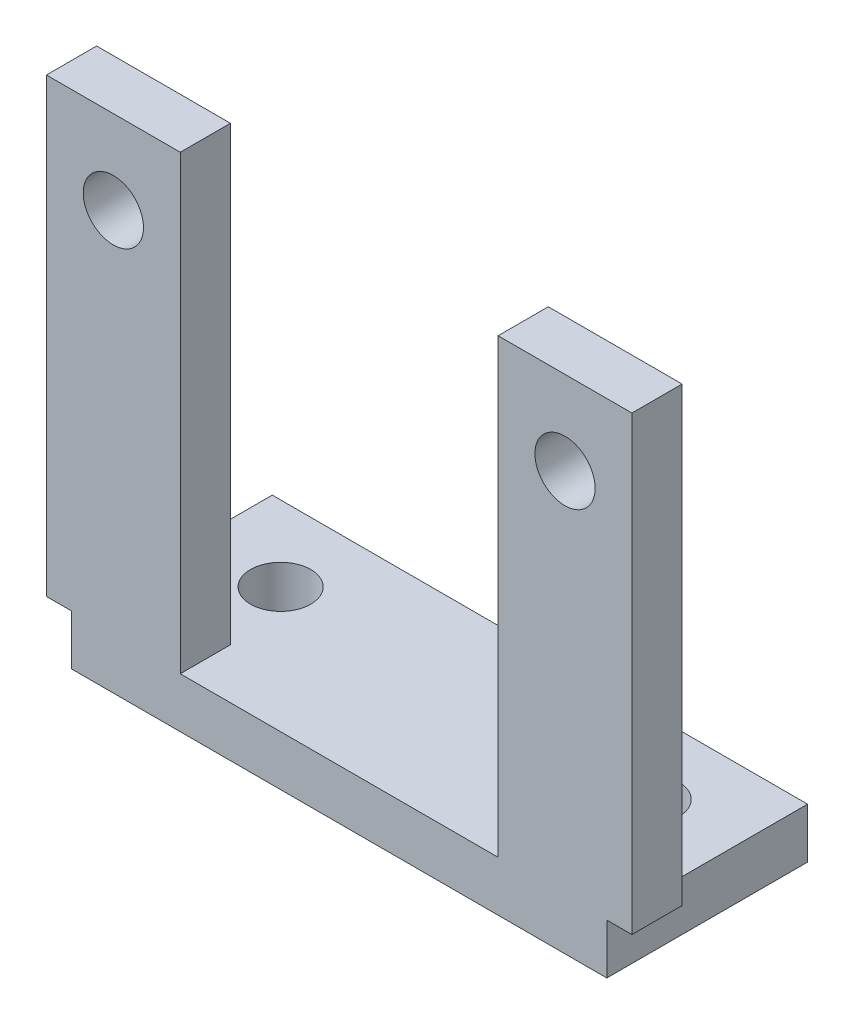
ISO-10303-21;
HEADER;
FILE_DESCRIPTION(('STEP AP214'),'2;1');
FILE_NAME('part.step','',(''),(''),'','','');
FILE_SCHEMA(('AUTOMOTIVE_DESIGN { 1 0 10303 214 1 1 1 1 }'));
ENDSEC;
DATA;
#1=APPLICATION_CONTEXT('core data for automotive mechanical design processes');
#2=APPLICATION_PROTOCOL_DEFINITION('international standard','automotive_design',2000,#1);
#3=PRODUCT_CONTEXT('',#1,'mechanical');
#4=PRODUCT('Part','Part','',(#3));
#5=PRODUCT_RELATED_PRODUCT_CATEGORY('part','',(#4));
#6=PRODUCT_DEFINITION_FORMATION('','',#4);
#7=PRODUCT_DEFINITION_CONTEXT('part definition',#1,'design');
#8=PRODUCT_DEFINITION('design','',#6,#7);
#9=PRODUCT_DEFINITION_SHAPE('','',#8);
#10=(LENGTH_UNIT() NAMED_UNIT(*) SI_UNIT(.MILLI.,.METRE.));
#11=(NAMED_UNIT(*) PLANE_ANGLE_UNIT() SI_UNIT($,.RADIAN.));
#12=(NAMED_UNIT(*) SI_UNIT($,.STERADIAN.) SOLID_ANGLE_UNIT());
#13=UNCERTAINTY_MEASURE_WITH_UNIT(LENGTH_MEASURE(1.E-05),#10,'distance_accuracy_value','');
#14=(GEOMETRIC_REPRESENTATION_CONTEXT(3) GLOBAL_UNCERTAINTY_ASSIGNED_CONTEXT((#13)) GLOBAL_UNIT_ASSIGNED_CONTEXT((#10,
#11,#12)) REPRESENTATION_CONTEXT('',''));
#15=CARTESIAN_POINT('',(0.,0.,0.));
#16=DIRECTION('',(0.,0.,1.));
#17=DIRECTION('',(1.,0.,0.));
#18=AXIS2_PLACEMENT_3D('',#15,#16,#17);
#19=CARTESIAN_POINT('',(0.,3.,0.));
#20=DIRECTION('',(0.,-1.,0.));
#21=DIRECTION('',(0.,0.,-1.));
#22=AXIS2_PLACEMENT_3D('',#19,#20,#21);
#23=PLANE('',#22);
#24=CARTESIAN_POINT('',(-11.,3.,-4.5));
#25=DIRECTION('',(0.,1.,0.));
#26=DIRECTION('',(0.,0.,1.));
#27=AXIS2_PLACEMENT_3D('',#24,#25,#26);
#28=CIRCLE('',#27,1.8);
#29=CARTESIAN_POINT('',(-11.,3.,-2.7));
#30=VERTEX_POINT('',#29);
#31=EDGE_CURVE('E303',#30,#30,#28,.T.);
#32=ORIENTED_EDGE('',*,*,#31,.F.);
#33=EDGE_LOOP('',(#32));
#34=FACE_BOUND('',#33,.T.);
#35=CARTESIAN_POINT('',(11.,3.,-4.5));
#36=DIRECTION('',(0.,1.,0.));
#37=DIRECTION('',(0.,0.,1.));
#38=AXIS2_PLACEMENT_3D('',#35,#36,#37);
#39=CIRCLE('',#38,1.8);
#40=CARTESIAN_POINT('',(11.,3.,-2.7));
#41=VERTEX_POINT('',#40);
#42=EDGE_CURVE('E310',#41,#41,#39,.T.);
#43=ORIENTED_EDGE('',*,*,#42,.F.);
#44=EDGE_LOOP('',(#43));
#45=FACE_BOUND('',#44,.T.);
#46=DIRECTION('',(0.,0.,-1.));
#47=VECTOR('',#46,1.);
#48=CARTESIAN_POINT('',(9.5,3.,3.));
#49=LINE('',#48,#47);
#50=CARTESIAN_POINT('',(9.5,3.,3.));
#51=VERTEX_POINT('',#50);
#52=CARTESIAN_POINT('',(9.5,3.,0.));
#53=VERTEX_POINT('',#52);
#54=EDGE_CURVE('E149',#51,#53,#49,.T.);
#55=ORIENTED_EDGE('',*,*,#54,.T.);
#56=DIRECTION('',(1.,0.,0.));
#57=VECTOR('',#56,1.);
#58=CARTESIAN_POINT('',(9.5,3.,0.));
#59=LINE('',#58,#57);
#60=CARTESIAN_POINT('',(16.,3.,0.));
#61=VERTEX_POINT('',#60);
#62=EDGE_CURVE('E52',#53,#61,#59,.T.);
#63=ORIENTED_EDGE('',*,*,#62,.T.);
#64=DIRECTION('',(0.,0.,-1.));
#65=VECTOR('',#64,1.);
#66=CARTESIAN_POINT('',(16.,3.,-9.));
#67=LINE('',#66,#65);
#68=CARTESIAN_POINT('',(16.,3.,-9.));
#69=VERTEX_POINT('',#68);
#70=EDGE_CURVE('E210',#61,#69,#67,.T.);
#71=ORIENTED_EDGE('',*,*,#70,.T.);
#72=DIRECTION('',(-1.,0.,0.));
#73=VECTOR('',#72,1.);
#74=CARTESIAN_POINT('',(-16.,3.,-9.));
#75=LINE('',#74,#73);
#76=CARTESIAN_POINT('',(-16.,3.,-9.));
#77=VERTEX_POINT('',#76);
#78=EDGE_CURVE('E213',#69,#77,#75,.T.);
#79=ORIENTED_EDGE('',*,*,#78,.T.);
#80=DIRECTION('',(0.,0.,1.));
#81=VECTOR('',#80,1.);
#82=CARTESIAN_POINT('',(-16.,3.,3.));
#83=LINE('',#82,#81);
#84=CARTESIAN_POINT('',(-16.,3.,0.));
#85=VERTEX_POINT('',#84);
#86=EDGE_CURVE('E205',#77,#85,#83,.T.);
#87=ORIENTED_EDGE('',*,*,#86,.T.);
#88=DIRECTION('',(1.,0.,0.));
#89=VECTOR('',#88,1.);
#90=CARTESIAN_POINT('',(-17.5,3.,0.));
#91=LINE('',#90,#89);
#92=CARTESIAN_POINT('',(-9.5,3.,0.));
#93=VERTEX_POINT('',#92);
#94=EDGE_CURVE('E11',#85,#93,#91,.T.);
#95=ORIENTED_EDGE('',*,*,#94,.T.);
#96=DIRECTION('',(0.,0.,-1.));
#97=VECTOR('',#96,1.);
#98=CARTESIAN_POINT('',(-9.5,3.,3.));
#99=LINE('',#98,#97);
#100=CARTESIAN_POINT('',(-9.5,3.,3.));
#101=VERTEX_POINT('',#100);
#102=EDGE_CURVE('E198',#101,#93,#99,.T.);
#103=ORIENTED_EDGE('',*,*,#102,.F.);
#104=DIRECTION('',(1.,0.,0.));
#105=VECTOR('',#104,1.);
#106=CARTESIAN_POINT('',(16.,3.,3.));
#107=LINE('',#106,#105);
#108=EDGE_CURVE('E58',#101,#51,#107,.T.);
#109=ORIENTED_EDGE('',*,*,#108,.T.);
#110=EDGE_LOOP('',(#55,#63,#71,#79,#87,#95,#103,#109));
#111=FACE_BOUND('',#110,.T.);
#112=ADVANCED_FACE('F35',(#34,#45,#111),#23,.F.);
#113=CARTESIAN_POINT('',(-16.,3.,3.));
#114=DIRECTION('',(1.,0.,0.));
#115=DIRECTION('',(0.,0.,-1.));
#116=AXIS2_PLACEMENT_3D('',#113,#114,#115);
#117=PLANE('',#116);
#118=DIRECTION('',(0.,0.,1.));
#119=VECTOR('',#118,1.);
#120=CARTESIAN_POINT('',(-16.,0.,3.));
#121=LINE('',#120,#119);
#122=CARTESIAN_POINT('',(-16.,0.,-9.));
#123=VERTEX_POINT('',#122);
#124=CARTESIAN_POINT('',(-16.,0.,3.));
#125=VERTEX_POINT('',#124);
#126=EDGE_CURVE('E204',#123,#125,#121,.T.);
#127=ORIENTED_EDGE('',*,*,#126,.T.);
#128=DIRECTION('',(0.,-1.,0.));
#129=VECTOR('',#128,1.);
#130=CARTESIAN_POINT('',(-16.,3.,3.));
#131=LINE('',#130,#129);
#132=CARTESIAN_POINT('',(-16.,3.,3.));
#133=VERTEX_POINT('',#132);
#134=EDGE_CURVE('E39',#133,#125,#131,.T.);
#135=ORIENTED_EDGE('',*,*,#134,.F.);
#136=EDGE_CURVE('E208',#85,#133,#83,.T.);
#137=ORIENTED_EDGE('',*,*,#136,.F.);
#138=ORIENTED_EDGE('',*,*,#86,.F.);
#139=DIRECTION('',(0.,-1.,0.));
#140=VECTOR('',#139,1.);
#141=CARTESIAN_POINT('',(-16.,3.,-9.));
#142=LINE('',#141,#140);
#143=EDGE_CURVE('E215',#77,#123,#142,.T.);
#144=ORIENTED_EDGE('',*,*,#143,.T.);
#145=EDGE_LOOP('',(#127,#135,#137,#138,#144));
#146=FACE_BOUND('',#145,.T.);
#147=ADVANCED_FACE('F37',(#146),#117,.F.);
#148=CARTESIAN_POINT('',(16.,3.,3.));
#149=DIRECTION('',(0.,0.,-1.));
#150=DIRECTION('',(-1.,0.,0.));
#151=AXIS2_PLACEMENT_3D('',#148,#149,#150);
#152=PLANE('',#151);
#153=CARTESIAN_POINT('',(-13.5,25.,3.));
#154=DIRECTION('',(0.,0.,1.));
#155=DIRECTION('',(1.,0.,0.));
#156=AXIS2_PLACEMENT_3D('',#153,#154,#155);
#157=CIRCLE('',#156,1.8);
#158=CARTESIAN_POINT('',(-11.7,25.,3.));
#159=VERTEX_POINT('',#158);
#160=EDGE_CURVE('E164',#159,#159,#157,.T.);
#161=ORIENTED_EDGE('',*,*,#160,.F.);
#162=EDGE_LOOP('',(#161));
#163=FACE_BOUND('',#162,.T.);
#164=CARTESIAN_POINT('',(13.5,25.,3.));
#165=DIRECTION('',(0.,0.,1.));
#166=DIRECTION('',(1.,0.,0.));
#167=AXIS2_PLACEMENT_3D('',#164,#165,#166);
#168=CIRCLE('',#167,1.8);
#169=CARTESIAN_POINT('',(15.3,25.,3.));
#170=VERTEX_POINT('',#169);
#171=EDGE_CURVE('E295',#170,#170,#168,.T.);
#172=ORIENTED_EDGE('',*,*,#171,.F.);
#173=EDGE_LOOP('',(#172));
#174=FACE_BOUND('',#173,.T.);
#175=DIRECTION('',(1.,0.,0.));
#176=VECTOR('',#175,1.);
#177=CARTESIAN_POINT('',(16.,0.,3.));
#178=LINE('',#177,#176);
#179=CARTESIAN_POINT('',(16.,0.,3.));
#180=VERTEX_POINT('',#179);
#181=EDGE_CURVE('E218',#125,#180,#178,.T.);
#182=ORIENTED_EDGE('',*,*,#181,.T.);
#183=DIRECTION('',(0.,-1.,0.));
#184=VECTOR('',#183,1.);
#185=CARTESIAN_POINT('',(16.,3.,3.));
#186=LINE('',#185,#184);
#187=CARTESIAN_POINT('',(16.,3.,3.));
#188=VERTEX_POINT('',#187);
#189=EDGE_CURVE('E136',#188,#180,#186,.T.);
#190=ORIENTED_EDGE('',*,*,#189,.F.);
#191=DIRECTION('',(1.,0.,0.));
#192=VECTOR('',#191,1.);
#193=CARTESIAN_POINT('',(9.5,3.,3.));
#194=LINE('',#193,#192);
#195=CARTESIAN_POINT('',(17.5,3.,3.));
#196=VERTEX_POINT('',#195);
#197=EDGE_CURVE('E129',#188,#196,#194,.T.);
#198=ORIENTED_EDGE('',*,*,#197,.T.);
#199=DIRECTION('',(0.,1.,0.));
#200=VECTOR('',#199,1.);
#201=CARTESIAN_POINT('',(17.5,3.,3.));
#202=LINE('',#201,#200);
#203=CARTESIAN_POINT('',(17.5,30.,3.));
#204=VERTEX_POINT('',#203);
#205=EDGE_CURVE('E133',#196,#204,#202,.T.);
#206=ORIENTED_EDGE('',*,*,#205,.T.);
#207=DIRECTION('',(-1.,0.,0.));
#208=VECTOR('',#207,1.);
#209=CARTESIAN_POINT('',(17.5,30.,3.));
#210=LINE('',#209,#208);
#211=CARTESIAN_POINT('',(9.5,30.,3.));
#212=VERTEX_POINT('',#211);
#213=EDGE_CURVE('E155',#204,#212,#210,.T.);
#214=ORIENTED_EDGE('',*,*,#213,.T.);
#215=DIRECTION('',(0.,-1.,0.));
#216=VECTOR('',#215,1.);
#217=CARTESIAN_POINT('',(9.5,30.,3.));
#218=LINE('',#217,#216);
#219=EDGE_CURVE('E140',#212,#51,#218,.T.);
#220=ORIENTED_EDGE('',*,*,#219,.T.);
#221=ORIENTED_EDGE('',*,*,#108,.F.);
#222=DIRECTION('',(0.,1.,0.));
#223=VECTOR('',#222,1.);
#224=CARTESIAN_POINT('',(-9.5,3.,3.));
#225=LINE('',#224,#223);
#226=CARTESIAN_POINT('',(-9.5,30.,3.));
#227=VERTEX_POINT('',#226);
#228=EDGE_CURVE('E182',#101,#227,#225,.T.);
#229=ORIENTED_EDGE('',*,*,#228,.T.);
#230=DIRECTION('',(-1.,0.,0.));
#231=VECTOR('',#230,1.);
#232=CARTESIAN_POINT('',(-9.5,30.,3.));
#233=LINE('',#232,#231);
#234=CARTESIAN_POINT('',(-17.5,30.,3.));
#235=VERTEX_POINT('',#234);
#236=EDGE_CURVE('E184',#227,#235,#233,.T.);
#237=ORIENTED_EDGE('',*,*,#236,.T.);
#238=DIRECTION('',(0.,-1.,0.));
#239=VECTOR('',#238,1.);
#240=CARTESIAN_POINT('',(-17.5,30.,3.));
#241=LINE('',#240,#239);
#242=CARTESIAN_POINT('',(-17.5,3.,3.));
#243=VERTEX_POINT('',#242);
#244=EDGE_CURVE('E175',#235,#243,#241,.T.);
#245=ORIENTED_EDGE('',*,*,#244,.T.);
#246=DIRECTION('',(1.,0.,0.));
#247=VECTOR('',#246,1.);
#248=CARTESIAN_POINT('',(-17.5,3.,3.));
#249=LINE('',#248,#247);
#250=EDGE_CURVE('E178',#243,#133,#249,.T.);
#251=ORIENTED_EDGE('',*,*,#250,.T.);
#252=ORIENTED_EDGE('',*,*,#134,.T.);
#253=EDGE_LOOP('',(#182,#190,#198,#206,#214,#220,#221,#229,#237,#245,#251,#252));
#254=FACE_BOUND('',#253,.T.);
#255=ADVANCED_FACE('F131',(#163,#174,#254),#152,.F.);
#256=CARTESIAN_POINT('',(16.,3.,-9.));
#257=DIRECTION('',(-1.,0.,0.));
#258=DIRECTION('',(0.,0.,1.));
#259=AXIS2_PLACEMENT_3D('',#256,#257,#258);
#260=PLANE('',#259);
#261=DIRECTION('',(0.,0.,-1.));
#262=VECTOR('',#261,1.);
#263=CARTESIAN_POINT('',(16.,0.,-9.));
#264=LINE('',#263,#262);
#265=CARTESIAN_POINT('',(16.,0.,-9.));
#266=VERTEX_POINT('',#265);
#267=EDGE_CURVE('E220',#180,#266,#264,.T.);
#268=ORIENTED_EDGE('',*,*,#267,.T.);
#269=DIRECTION('',(0.,-1.,0.));
#270=VECTOR('',#269,1.);
#271=CARTESIAN_POINT('',(16.,3.,-9.));
#272=LINE('',#271,#270);
#273=EDGE_CURVE('E226',#69,#266,#272,.T.);
#274=ORIENTED_EDGE('',*,*,#273,.F.);
#275=ORIENTED_EDGE('',*,*,#70,.F.);
#276=EDGE_CURVE('E211',#188,#61,#67,.T.);
#277=ORIENTED_EDGE('',*,*,#276,.F.);
#278=ORIENTED_EDGE('',*,*,#189,.T.);
#279=EDGE_LOOP('',(#268,#274,#275,#277,#278));
#280=FACE_BOUND('',#279,.T.);
#281=ADVANCED_FACE('F240',(#280),#260,.F.);
#282=CARTESIAN_POINT('',(-16.,3.,-9.));
#283=DIRECTION('',(0.,0.,1.));
#284=DIRECTION('',(1.,0.,0.));
#285=AXIS2_PLACEMENT_3D('',#282,#283,#284);
#286=PLANE('',#285);
#287=DIRECTION('',(-1.,0.,0.));
#288=VECTOR('',#287,1.);
#289=CARTESIAN_POINT('',(-16.,0.,-9.));
#290=LINE('',#289,#288);
#291=EDGE_CURVE('E222',#266,#123,#290,.T.);
#292=ORIENTED_EDGE('',*,*,#291,.T.);
#293=ORIENTED_EDGE('',*,*,#143,.F.);
#294=ORIENTED_EDGE('',*,*,#78,.F.);
#295=ORIENTED_EDGE('',*,*,#273,.T.);
#296=EDGE_LOOP('',(#292,#293,#294,#295));
#297=FACE_BOUND('',#296,.T.);
#298=ADVANCED_FACE('F243',(#297),#286,.F.);
#299=CARTESIAN_POINT('',(0.,0.,0.));
#300=DIRECTION('',(0.,-1.,0.));
#301=DIRECTION('',(0.,0.,-1.));
#302=AXIS2_PLACEMENT_3D('',#299,#300,#301);
#303=PLANE('',#302);
#304=CARTESIAN_POINT('',(-11.,0.,-4.5));
#305=DIRECTION('',(0.,1.,0.));
#306=DIRECTION('',(0.,0.,1.));
#307=AXIS2_PLACEMENT_3D('',#304,#305,#306);
#308=CIRCLE('',#307,1.8);
#309=CARTESIAN_POINT('',(-11.,0.,-2.7));
#310=VERTEX_POINT('',#309);
#311=EDGE_CURVE('E313',#310,#310,#308,.T.);
#312=ORIENTED_EDGE('',*,*,#311,.T.);
#313=EDGE_LOOP('',(#312));
#314=FACE_BOUND('',#313,.T.);
#315=CARTESIAN_POINT('',(11.,0.,-4.5));
#316=DIRECTION('',(0.,1.,0.));
#317=DIRECTION('',(0.,0.,1.));
#318=AXIS2_PLACEMENT_3D('',#315,#316,#317);
#319=CIRCLE('',#318,1.8);
#320=CARTESIAN_POINT('',(11.,0.,-2.7));
#321=VERTEX_POINT('',#320);
#322=EDGE_CURVE('E307',#321,#321,#319,.T.);
#323=ORIENTED_EDGE('',*,*,#322,.T.);
#324=EDGE_LOOP('',(#323));
#325=FACE_BOUND('',#324,.T.);
#326=ORIENTED_EDGE('',*,*,#126,.F.);
#327=ORIENTED_EDGE('',*,*,#291,.F.);
#328=ORIENTED_EDGE('',*,*,#267,.F.);
#329=ORIENTED_EDGE('',*,*,#181,.F.);
#330=EDGE_LOOP('',(#326,#327,#328,#329));
#331=FACE_BOUND('',#330,.T.);
#332=ADVANCED_FACE('F238',(#314,#325,#331),#303,.T.);
#333=CARTESIAN_POINT('',(-17.5,3.,3.));
#334=DIRECTION('',(0.,1.,0.));
#335=DIRECTION('',(0.,0.,1.));
#336=AXIS2_PLACEMENT_3D('',#333,#334,#335);
#337=PLANE('',#336);
#338=CARTESIAN_POINT('',(-17.5,3.,0.));
#339=VERTEX_POINT('',#338);
#340=EDGE_CURVE('E45',#339,#85,#91,.T.);
#341=ORIENTED_EDGE('',*,*,#340,.T.);
#342=ORIENTED_EDGE('',*,*,#136,.T.);
#343=ORIENTED_EDGE('',*,*,#250,.F.);
#344=DIRECTION('',(0.,0.,-1.));
#345=VECTOR('',#344,1.);
#346=CARTESIAN_POINT('',(-17.5,3.,3.));
#347=LINE('',#346,#345);
#348=EDGE_CURVE('E201',#243,#339,#347,.T.);
#349=ORIENTED_EDGE('',*,*,#348,.T.);
#350=EDGE_LOOP('',(#341,#342,#343,#349));
#351=FACE_BOUND('',#350,.T.);
#352=ADVANCED_FACE('F281',(#351),#337,.F.);
#353=CARTESIAN_POINT('',(-17.5,30.,3.));
#354=DIRECTION('',(1.,0.,0.));
#355=DIRECTION('',(0.,0.,-1.));
#356=AXIS2_PLACEMENT_3D('',#353,#354,#355);
#357=PLANE('',#356);
#358=DIRECTION('',(0.,-1.,0.));
#359=VECTOR('',#358,1.);
#360=CARTESIAN_POINT('',(-17.5,30.,0.));
#361=LINE('',#360,#359);
#362=CARTESIAN_POINT('',(-17.5,30.,0.));
#363=VERTEX_POINT('',#362);
#364=EDGE_CURVE('E174',#363,#339,#361,.T.);
#365=ORIENTED_EDGE('',*,*,#364,.T.);
#366=ORIENTED_EDGE('',*,*,#348,.F.);
#367=ORIENTED_EDGE('',*,*,#244,.F.);
#368=DIRECTION('',(0.,0.,-1.));
#369=VECTOR('',#368,1.);
#370=CARTESIAN_POINT('',(-17.5,30.,3.));
#371=LINE('',#370,#369);
#372=EDGE_CURVE('E186',#235,#363,#371,.T.);
#373=ORIENTED_EDGE('',*,*,#372,.T.);
#374=EDGE_LOOP('',(#365,#366,#367,#373));
#375=FACE_BOUND('',#374,.T.);
#376=ADVANCED_FACE('F277',(#375),#357,.F.);
#377=CARTESIAN_POINT('',(-9.5,3.,3.));
#378=DIRECTION('',(-1.,0.,0.));
#379=DIRECTION('',(0.,0.,1.));
#380=AXIS2_PLACEMENT_3D('',#377,#378,#379);
#381=PLANE('',#380);
#382=DIRECTION('',(0.,1.,0.));
#383=VECTOR('',#382,1.);
#384=CARTESIAN_POINT('',(-9.5,3.,0.));
#385=LINE('',#384,#383);
#386=CARTESIAN_POINT('',(-9.5,30.,0.));
#387=VERTEX_POINT('',#386);
#388=EDGE_CURVE('E190',#93,#387,#385,.T.);
#389=ORIENTED_EDGE('',*,*,#388,.T.);
#390=DIRECTION('',(0.,0.,-1.));
#391=VECTOR('',#390,1.);
#392=CARTESIAN_POINT('',(-9.5,30.,3.));
#393=LINE('',#392,#391);
#394=EDGE_CURVE('E195',#227,#387,#393,.T.);
#395=ORIENTED_EDGE('',*,*,#394,.F.);
#396=ORIENTED_EDGE('',*,*,#228,.F.);
#397=ORIENTED_EDGE('',*,*,#102,.T.);
#398=EDGE_LOOP('',(#389,#395,#396,#397));
#399=FACE_BOUND('',#398,.T.);
#400=ADVANCED_FACE('F400',(#399),#381,.F.);
#401=CARTESIAN_POINT('',(-9.5,30.,3.));
#402=DIRECTION('',(0.,-1.,0.));
#403=DIRECTION('',(0.,0.,-1.));
#404=AXIS2_PLACEMENT_3D('',#401,#402,#403);
#405=PLANE('',#404);
#406=DIRECTION('',(-1.,0.,0.));
#407=VECTOR('',#406,1.);
#408=CARTESIAN_POINT('',(-9.5,30.,0.));
#409=LINE('',#408,#407);
#410=EDGE_CURVE('E179',#387,#363,#409,.T.);
#411=ORIENTED_EDGE('',*,*,#410,.T.);
#412=ORIENTED_EDGE('',*,*,#372,.F.);
#413=ORIENTED_EDGE('',*,*,#236,.F.);
#414=ORIENTED_EDGE('',*,*,#394,.T.);
#415=EDGE_LOOP('',(#411,#412,#413,#414));
#416=FACE_BOUND('',#415,.T.);
#417=ADVANCED_FACE('F407',(#416),#405,.F.);
#418=CARTESIAN_POINT('',(0.,0.,0.));
#419=DIRECTION('',(0.,0.,1.));
#420=DIRECTION('',(1.,0.,0.));
#421=AXIS2_PLACEMENT_3D('',#418,#419,#420);
#422=PLANE('',#421);
#423=CARTESIAN_POINT('',(-13.5,25.,0.));
#424=DIRECTION('',(0.,0.,1.));
#425=DIRECTION('',(1.,0.,0.));
#426=AXIS2_PLACEMENT_3D('',#423,#424,#425);
#427=CIRCLE('',#426,1.8);
#428=CARTESIAN_POINT('',(-11.7,25.,0.));
#429=VERTEX_POINT('',#428);
#430=EDGE_CURVE('E297',#429,#429,#427,.T.);
#431=ORIENTED_EDGE('',*,*,#430,.T.);
#432=EDGE_LOOP('',(#431));
#433=FACE_BOUND('',#432,.T.);
#434=ORIENTED_EDGE('',*,*,#364,.F.);
#435=ORIENTED_EDGE('',*,*,#410,.F.);
#436=ORIENTED_EDGE('',*,*,#388,.F.);
#437=ORIENTED_EDGE('',*,*,#94,.F.);
#438=ORIENTED_EDGE('',*,*,#340,.F.);
#439=EDGE_LOOP('',(#434,#435,#436,#437,#438));
#440=FACE_BOUND('',#439,.T.);
#441=ADVANCED_FACE('F264',(#433,#440),#422,.F.);
#442=CARTESIAN_POINT('',(9.5,3.,3.));
#443=DIRECTION('',(0.,1.,0.));
#444=DIRECTION('',(0.,0.,1.));
#445=AXIS2_PLACEMENT_3D('',#442,#443,#444);
#446=PLANE('',#445);
#447=ORIENTED_EDGE('',*,*,#197,.F.);
#448=ORIENTED_EDGE('',*,*,#276,.T.);
#449=CARTESIAN_POINT('',(17.5,3.,0.));
#450=VERTEX_POINT('',#449);
#451=EDGE_CURVE('E146',#61,#450,#59,.T.);
#452=ORIENTED_EDGE('',*,*,#451,.T.);
#453=DIRECTION('',(0.,0.,-1.));
#454=VECTOR('',#453,1.);
#455=CARTESIAN_POINT('',(17.5,3.,3.));
#456=LINE('',#455,#454);
#457=EDGE_CURVE('E143',#196,#450,#456,.T.);
#458=ORIENTED_EDGE('',*,*,#457,.F.);
#459=EDGE_LOOP('',(#447,#448,#452,#458));
#460=FACE_BOUND('',#459,.T.);
#461=ADVANCED_FACE('F144',(#460),#446,.F.);
#462=CARTESIAN_POINT('',(9.5,30.,3.));
#463=DIRECTION('',(1.,0.,0.));
#464=DIRECTION('',(0.,0.,-1.));
#465=AXIS2_PLACEMENT_3D('',#462,#463,#464);
#466=PLANE('',#465);
#467=DIRECTION('',(0.,-1.,0.));
#468=VECTOR('',#467,1.);
#469=CARTESIAN_POINT('',(9.5,30.,0.));
#470=LINE('',#469,#468);
#471=CARTESIAN_POINT('',(9.5,30.,0.));
#472=VERTEX_POINT('',#471);
#473=EDGE_CURVE('E161',#472,#53,#470,.T.);
#474=ORIENTED_EDGE('',*,*,#473,.T.);
#475=ORIENTED_EDGE('',*,*,#54,.F.);
#476=ORIENTED_EDGE('',*,*,#219,.F.);
#477=DIRECTION('',(0.,0.,-1.));
#478=VECTOR('',#477,1.);
#479=CARTESIAN_POINT('',(9.5,30.,3.));
#480=LINE('',#479,#478);
#481=EDGE_CURVE('E157',#212,#472,#480,.T.);
#482=ORIENTED_EDGE('',*,*,#481,.T.);
#483=EDGE_LOOP('',(#474,#475,#476,#482));
#484=FACE_BOUND('',#483,.T.);
#485=ADVANCED_FACE('F256',(#484),#466,.F.);
#486=CARTESIAN_POINT('',(17.5,3.,3.));
#487=DIRECTION('',(-1.,0.,0.));
#488=DIRECTION('',(0.,0.,1.));
#489=AXIS2_PLACEMENT_3D('',#486,#487,#488);
#490=PLANE('',#489);
#491=DIRECTION('',(0.,1.,0.));
#492=VECTOR('',#491,1.);
#493=CARTESIAN_POINT('',(17.5,3.,0.));
#494=LINE('',#493,#492);
#495=CARTESIAN_POINT('',(17.5,30.,0.));
#496=VERTEX_POINT('',#495);
#497=EDGE_CURVE('E166',#450,#496,#494,.T.);
#498=ORIENTED_EDGE('',*,*,#497,.T.);
#499=DIRECTION('',(0.,0.,-1.));
#500=VECTOR('',#499,1.);
#501=CARTESIAN_POINT('',(17.5,30.,3.));
#502=LINE('',#501,#500);
#503=EDGE_CURVE('E150',#204,#496,#502,.T.);
#504=ORIENTED_EDGE('',*,*,#503,.F.);
#505=ORIENTED_EDGE('',*,*,#205,.F.);
#506=ORIENTED_EDGE('',*,*,#457,.T.);
#507=EDGE_LOOP('',(#498,#504,#505,#506));
#508=FACE_BOUND('',#507,.T.);
#509=ADVANCED_FACE('F152',(#508),#490,.F.);
#510=CARTESIAN_POINT('',(17.5,30.,3.));
#511=DIRECTION('',(0.,-1.,0.));
#512=DIRECTION('',(0.,0.,-1.));
#513=AXIS2_PLACEMENT_3D('',#510,#511,#512);
#514=PLANE('',#513);
#515=DIRECTION('',(-1.,0.,0.));
#516=VECTOR('',#515,1.);
#517=CARTESIAN_POINT('',(17.5,30.,0.));
#518=LINE('',#517,#516);
#519=EDGE_CURVE('E168',#496,#472,#518,.T.);
#520=ORIENTED_EDGE('',*,*,#519,.T.);
#521=ORIENTED_EDGE('',*,*,#481,.F.);
#522=ORIENTED_EDGE('',*,*,#213,.F.);
#523=ORIENTED_EDGE('',*,*,#503,.T.);
#524=EDGE_LOOP('',(#520,#521,#522,#523));
#525=FACE_BOUND('',#524,.T.);
#526=ADVANCED_FACE('F250',(#525),#514,.F.);
#527=CARTESIAN_POINT('',(0.,0.,0.));
#528=DIRECTION('',(0.,0.,1.));
#529=DIRECTION('',(1.,0.,0.));
#530=AXIS2_PLACEMENT_3D('',#527,#528,#529);
#531=PLANE('',#530);
#532=CARTESIAN_POINT('',(13.5,25.,0.));
#533=DIRECTION('',(0.,0.,1.));
#534=DIRECTION('',(1.,0.,0.));
#535=AXIS2_PLACEMENT_3D('',#532,#533,#534);
#536=CIRCLE('',#535,1.8);
#537=CARTESIAN_POINT('',(15.3,25.,0.));
#538=VERTEX_POINT('',#537);
#539=EDGE_CURVE('E298',#538,#538,#536,.T.);
#540=ORIENTED_EDGE('',*,*,#539,.T.);
#541=EDGE_LOOP('',(#540));
#542=FACE_BOUND('',#541,.T.);
#543=ORIENTED_EDGE('',*,*,#473,.F.);
#544=ORIENTED_EDGE('',*,*,#519,.F.);
#545=ORIENTED_EDGE('',*,*,#497,.F.);
#546=ORIENTED_EDGE('',*,*,#451,.F.);
#547=ORIENTED_EDGE('',*,*,#62,.F.);
#548=EDGE_LOOP('',(#543,#544,#545,#546,#547));
#549=FACE_BOUND('',#548,.T.);
#550=ADVANCED_FACE('F247',(#542,#549),#531,.F.);
#551=CARTESIAN_POINT('',(13.5,25.,3.));
#552=DIRECTION('',(0.,0.,-1.));
#553=DIRECTION('',(-1.,0.,0.));
#554=AXIS2_PLACEMENT_3D('',#551,#552,#553);
#555=CYLINDRICAL_SURFACE('',#554,1.8);
#556=ORIENTED_EDGE('',*,*,#171,.T.);
#557=EDGE_LOOP('',(#556));
#558=FACE_BOUND('',#557,.T.);
#559=ORIENTED_EDGE('',*,*,#539,.F.);
#560=EDGE_LOOP('',(#559));
#561=FACE_BOUND('',#560,.T.);
#562=ADVANCED_FACE('F334',(#558,#561),#555,.F.);
#563=CARTESIAN_POINT('',(-13.5,25.,3.));
#564=DIRECTION('',(0.,0.,-1.));
#565=DIRECTION('',(-1.,0.,0.));
#566=AXIS2_PLACEMENT_3D('',#563,#564,#565);
#567=CYLINDRICAL_SURFACE('',#566,1.8);
#568=ORIENTED_EDGE('',*,*,#160,.T.);
#569=EDGE_LOOP('',(#568));
#570=FACE_BOUND('',#569,.T.);
#571=ORIENTED_EDGE('',*,*,#430,.F.);
#572=EDGE_LOOP('',(#571));
#573=FACE_BOUND('',#572,.T.);
#574=ADVANCED_FACE('F328',(#570,#573),#567,.F.);
#575=CARTESIAN_POINT('',(11.,3.,-4.5));
#576=DIRECTION('',(0.,-1.,0.));
#577=DIRECTION('',(0.,0.,-1.));
#578=AXIS2_PLACEMENT_3D('',#575,#576,#577);
#579=CYLINDRICAL_SURFACE('',#578,1.8);
#580=ORIENTED_EDGE('',*,*,#42,.T.);
#581=EDGE_LOOP('',(#580));
#582=FACE_BOUND('',#581,.T.);
#583=ORIENTED_EDGE('',*,*,#322,.F.);
#584=EDGE_LOOP('',(#583));
#585=FACE_BOUND('',#584,.T.);
#586=ADVANCED_FACE('F321',(#582,#585),#579,.F.);
#587=CARTESIAN_POINT('',(-11.,3.,-4.5));
#588=DIRECTION('',(0.,-1.,0.));
#589=DIRECTION('',(0.,0.,-1.));
#590=AXIS2_PLACEMENT_3D('',#587,#588,#589);
#591=CYLINDRICAL_SURFACE('',#590,1.8);
#592=ORIENTED_EDGE('',*,*,#31,.T.);
#593=EDGE_LOOP('',(#592));
#594=FACE_BOUND('',#593,.T.);
#595=ORIENTED_EDGE('',*,*,#311,.F.);
#596=EDGE_LOOP('',(#595));
#597=FACE_BOUND('',#596,.T.);
#598=ADVANCED_FACE('F318',(#594,#597),#591,.F.);
#599=CLOSED_SHELL('',(#112,#147,#255,#281,#298,#332,#352,#376,#400,#417,#441,#461,#485,#509,
#526,#550,#562,#574,#586,#598));
#600=MANIFOLD_SOLID_BREP('B2',#599);
#601=ADVANCED_BREP_SHAPE_REPRESENTATION('',(#18,#600),#14);
#602=SHAPE_DEFINITION_REPRESENTATION(#9,#601);
ENDSEC;
END-ISO-10303-21;
